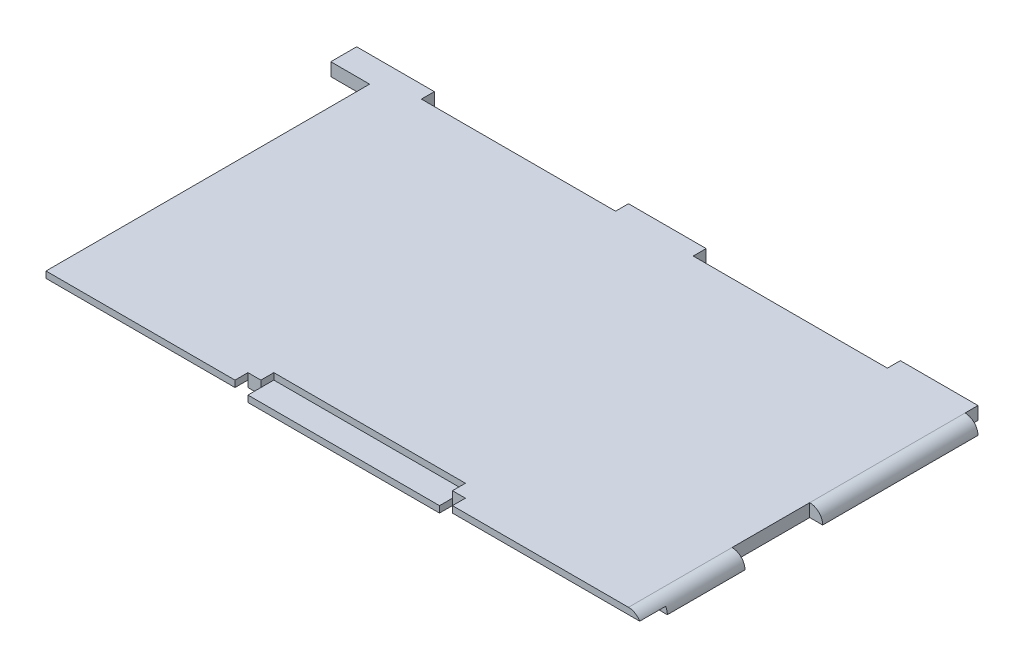
ISO-10303-21;
HEADER;
FILE_DESCRIPTION(('STEP AP214'),'2;1');
FILE_NAME('part.step','',(''),(''),'','','');
FILE_SCHEMA(('AUTOMOTIVE_DESIGN { 1 0 10303 214 1 1 1 1 }'));
ENDSEC;
DATA;
#1=APPLICATION_CONTEXT('core data for automotive mechanical design processes');
#2=APPLICATION_PROTOCOL_DEFINITION('international standard','automotive_design',2000,#1);
#3=PRODUCT_CONTEXT('',#1,'mechanical');
#4=PRODUCT('Part','Part','',(#3));
#5=PRODUCT_RELATED_PRODUCT_CATEGORY('part','',(#4));
#6=PRODUCT_DEFINITION_FORMATION('','',#4);
#7=PRODUCT_DEFINITION_CONTEXT('part definition',#1,'design');
#8=PRODUCT_DEFINITION('design','',#6,#7);
#9=PRODUCT_DEFINITION_SHAPE('','',#8);
#10=(LENGTH_UNIT() NAMED_UNIT(*) SI_UNIT(.MILLI.,.METRE.));
#11=(NAMED_UNIT(*) PLANE_ANGLE_UNIT() SI_UNIT($,.RADIAN.));
#12=(NAMED_UNIT(*) SI_UNIT($,.STERADIAN.) SOLID_ANGLE_UNIT());
#13=UNCERTAINTY_MEASURE_WITH_UNIT(LENGTH_MEASURE(1.E-05),#10,'distance_accuracy_value','');
#14=(GEOMETRIC_REPRESENTATION_CONTEXT(3) GLOBAL_UNCERTAINTY_ASSIGNED_CONTEXT((#13)) GLOBAL_UNIT_ASSIGNED_CONTEXT((#10,
#11,#12)) REPRESENTATION_CONTEXT('',''));
#15=CARTESIAN_POINT('',(0.,0.,0.));
#16=DIRECTION('',(0.,0.,1.));
#17=DIRECTION('',(1.,0.,0.));
#18=AXIS2_PLACEMENT_3D('',#15,#16,#17);
#19=CARTESIAN_POINT('',(208.746286717569,-5.,86.4649026606249));
#20=DIRECTION('',(0.,0.,-1.));
#21=DIRECTION('',(-1.,0.,0.));
#22=AXIS2_PLACEMENT_3D('',#19,#20,#21);
#23=PLANE('',#22);
#24=DIRECTION('',(-1.,0.,0.));
#25=VECTOR('',#24,1.);
#26=CARTESIAN_POINT('',(-21.2537132824313,2.5,86.4649026606249));
#27=LINE('',#26,#25);
#28=CARTESIAN_POINT('',(51.7462867175687,2.5,86.4649026606249));
#29=VERTEX_POINT('',#28);
#30=CARTESIAN_POINT('',(-21.2537132824313,2.5,86.4649026606249));
#31=VERTEX_POINT('',#30);
#32=EDGE_CURVE('E670',#29,#31,#27,.T.);
#33=ORIENTED_EDGE('',*,*,#32,.F.);
#34=DIRECTION('',(0.,-1.,0.));
#35=VECTOR('',#34,1.);
#36=CARTESIAN_POINT('',(51.7462867175687,0.,86.4649026606249));
#37=LINE('',#36,#35);
#38=CARTESIAN_POINT('',(51.7462867175687,5.,86.4649026606249));
#39=VERTEX_POINT('',#38);
#40=EDGE_CURVE('E1394',#39,#29,#37,.T.);
#41=ORIENTED_EDGE('',*,*,#40,.F.);
#42=DIRECTION('',(-1.,0.,0.));
#43=VECTOR('',#42,1.);
#44=CARTESIAN_POINT('',(208.746286717569,5.,86.4649026606249));
#45=LINE('',#44,#43);
#46=CARTESIAN_POINT('',(-21.2537132824313,5.,86.4649026606249));
#47=VERTEX_POINT('',#46);
#48=EDGE_CURVE('E703',#39,#47,#45,.T.);
#49=ORIENTED_EDGE('',*,*,#48,.T.);
#50=DIRECTION('',(0.,-1.,0.));
#51=VECTOR('',#50,1.);
#52=CARTESIAN_POINT('',(-21.2537132824313,5.,86.4649026606249));
#53=LINE('',#52,#51);
#54=EDGE_CURVE('E710',#47,#31,#53,.T.);
#55=ORIENTED_EDGE('',*,*,#54,.T.);
#56=EDGE_LOOP('',(#33,#41,#49,#55));
#57=FACE_BOUND('',#56,.T.);
#58=ADVANCED_FACE('F403',(#57),#23,.F.);
#59=DIRECTION('',(1.,0.,0.));
#60=VECTOR('',#59,1.);
#61=CARTESIAN_POINT('',(56.7462867175687,2.5,86.4649026606249));
#62=LINE('',#61,#60);
#63=CARTESIAN_POINT('',(56.7462867175687,2.5,86.4649026606249));
#64=VERTEX_POINT('',#63);
#65=CARTESIAN_POINT('',(130.746286717569,2.5,86.4649026606249));
#66=VERTEX_POINT('',#65);
#67=EDGE_CURVE('E687',#64,#66,#62,.T.);
#68=ORIENTED_EDGE('',*,*,#67,.F.);
#69=DIRECTION('',(0.,1.,0.));
#70=VECTOR('',#69,1.);
#71=CARTESIAN_POINT('',(56.7462867175687,0.,86.4649026606249));
#72=LINE('',#71,#70);
#73=CARTESIAN_POINT('',(56.7462867175687,0.,86.4649026606249));
#74=VERTEX_POINT('',#73);
#75=EDGE_CURVE('E1396',#74,#64,#72,.T.);
#76=ORIENTED_EDGE('',*,*,#75,.F.);
#77=DIRECTION('',(-1.,0.,0.));
#78=VECTOR('',#77,1.);
#79=CARTESIAN_POINT('',(0.,0.,86.4649026606249));
#80=LINE('',#79,#78);
#81=CARTESIAN_POINT('',(130.746286717569,0.,86.4649026606249));
#82=VERTEX_POINT('',#81);
#83=EDGE_CURVE('E708',#82,#74,#80,.T.);
#84=ORIENTED_EDGE('',*,*,#83,.F.);
#85=DIRECTION('',(0.,-1.,0.));
#86=VECTOR('',#85,1.);
#87=CARTESIAN_POINT('',(130.746286717569,5.,86.4649026606249));
#88=LINE('',#87,#86);
#89=EDGE_CURVE('E1397',#66,#82,#88,.T.);
#90=ORIENTED_EDGE('',*,*,#89,.F.);
#91=EDGE_LOOP('',(#68,#76,#84,#90));
#92=FACE_BOUND('',#91,.T.);
#93=ADVANCED_FACE('F996',(#92),#23,.F.);
#94=CARTESIAN_POINT('',(130.746286717569,2.5,76.4649026606249));
#95=DIRECTION('',(1.,0.,0.));
#96=DIRECTION('',(0.,0.,-1.));
#97=AXIS2_PLACEMENT_3D('',#94,#95,#96);
#98=PLANE('',#97);
#99=DIRECTION('',(0.,-1.,0.));
#100=VECTOR('',#99,1.);
#101=CARTESIAN_POINT('',(130.746286717569,5.,81.4649026606249));
#102=LINE('',#101,#100);
#103=CARTESIAN_POINT('',(130.746286717569,5.,81.4649026606249));
#104=VERTEX_POINT('',#103);
#105=CARTESIAN_POINT('',(130.746286717569,2.5,81.4649026606249));
#106=VERTEX_POINT('',#105);
#107=EDGE_CURVE('E896',#104,#106,#102,.T.);
#108=ORIENTED_EDGE('',*,*,#107,.F.);
#109=DIRECTION('',(0.,0.,1.));
#110=VECTOR('',#109,1.);
#111=CARTESIAN_POINT('',(130.746286717569,5.,76.4649026606249));
#112=LINE('',#111,#110);
#113=CARTESIAN_POINT('',(130.746286717569,5.,76.4649026606249));
#114=VERTEX_POINT('',#113);
#115=EDGE_CURVE('E680',#114,#104,#112,.T.);
#116=ORIENTED_EDGE('',*,*,#115,.F.);
#117=DIRECTION('',(0.,1.,0.));
#118=VECTOR('',#117,1.);
#119=CARTESIAN_POINT('',(130.746286717569,2.5,76.4649026606249));
#120=LINE('',#119,#118);
#121=CARTESIAN_POINT('',(130.746286717569,2.5,76.4649026606249));
#122=VERTEX_POINT('',#121);
#123=EDGE_CURVE('E693',#122,#114,#120,.T.);
#124=ORIENTED_EDGE('',*,*,#123,.F.);
#125=DIRECTION('',(0.,0.,1.));
#126=VECTOR('',#125,1.);
#127=CARTESIAN_POINT('',(130.746286717569,2.5,76.4649026606249));
#128=LINE('',#127,#126);
#129=EDGE_CURVE('E676',#122,#106,#128,.T.);
#130=ORIENTED_EDGE('',*,*,#129,.T.);
#131=EDGE_LOOP('',(#108,#116,#124,#130));
#132=FACE_BOUND('',#131,.T.);
#133=ADVANCED_FACE('F1003',(#132),#98,.F.);
#134=CARTESIAN_POINT('',(135.746286717569,2.5,76.4649026606249));
#135=DIRECTION('',(-1.,0.,0.));
#136=DIRECTION('',(0.,0.,1.));
#137=AXIS2_PLACEMENT_3D('',#134,#135,#136);
#138=PLANE('',#137);
#139=DIRECTION('',(0.,1.,0.));
#140=VECTOR('',#139,1.);
#141=CARTESIAN_POINT('',(135.746286717569,5.,81.4649026606249));
#142=LINE('',#141,#140);
#143=CARTESIAN_POINT('',(135.746286717569,0.,81.4649026606249));
#144=VERTEX_POINT('',#143);
#145=CARTESIAN_POINT('',(135.746286717569,2.5,81.4649026606249));
#146=VERTEX_POINT('',#145);
#147=EDGE_CURVE('E418',#144,#146,#142,.T.);
#148=ORIENTED_EDGE('',*,*,#147,.F.);
#149=DIRECTION('',(0.,0.,1.));
#150=VECTOR('',#149,1.);
#151=CARTESIAN_POINT('',(135.746286717569,0.,76.4649026606249));
#152=LINE('',#151,#150);
#153=CARTESIAN_POINT('',(135.746286717569,0.,76.4649026606249));
#154=VERTEX_POINT('',#153);
#155=EDGE_CURVE('E656',#154,#144,#152,.T.);
#156=ORIENTED_EDGE('',*,*,#155,.F.);
#157=DIRECTION('',(0.,-1.,0.));
#158=VECTOR('',#157,1.);
#159=CARTESIAN_POINT('',(135.746286717569,2.5,76.4649026606249));
#160=LINE('',#159,#158);
#161=CARTESIAN_POINT('',(135.746286717569,2.5,76.4649026606249));
#162=VERTEX_POINT('',#161);
#163=EDGE_CURVE('E667',#162,#154,#160,.T.);
#164=ORIENTED_EDGE('',*,*,#163,.F.);
#165=DIRECTION('',(0.,0.,1.));
#166=VECTOR('',#165,1.);
#167=CARTESIAN_POINT('',(135.746286717569,2.5,76.4649026606249));
#168=LINE('',#167,#166);
#169=EDGE_CURVE('E660',#162,#146,#168,.T.);
#170=ORIENTED_EDGE('',*,*,#169,.T.);
#171=EDGE_LOOP('',(#148,#156,#164,#170));
#172=FACE_BOUND('',#171,.T.);
#173=ADVANCED_FACE('F887',(#172),#138,.F.);
#174=CARTESIAN_POINT('',(203.746286717569,5.,0.));
#175=DIRECTION('',(1.,0.,0.));
#176=DIRECTION('',(0.,0.,-1.));
#177=AXIS2_PLACEMENT_3D('',#174,#175,#176);
#178=PLANE('',#177);
#179=DIRECTION('',(0.,0.,1.));
#180=VECTOR('',#179,1.);
#181=CARTESIAN_POINT('',(203.746286717569,5.,0.));
#182=LINE('',#181,#180);
#183=CARTESIAN_POINT('',(203.746286717569,5.,16.4649026606249));
#184=VERTEX_POINT('',#183);
#185=CARTESIAN_POINT('',(203.746286717569,5.,46.4649026606249));
#186=VERTEX_POINT('',#185);
#187=EDGE_CURVE('E714',#184,#186,#182,.T.);
#188=ORIENTED_EDGE('',*,*,#187,.T.);
#189=DIRECTION('',(0.,-1.,0.));
#190=VECTOR('',#189,1.);
#191=CARTESIAN_POINT('',(203.746286717569,5.,46.4649026606249));
#192=LINE('',#191,#190);
#193=CARTESIAN_POINT('',(203.746286717569,0.,46.4649026606249));
#194=VERTEX_POINT('',#193);
#195=EDGE_CURVE('E807',#186,#194,#192,.T.);
#196=ORIENTED_EDGE('',*,*,#195,.T.);
#197=DIRECTION('',(0.,0.,1.));
#198=VECTOR('',#197,1.);
#199=CARTESIAN_POINT('',(203.746286717569,0.,0.));
#200=LINE('',#199,#198);
#201=CARTESIAN_POINT('',(203.746286717569,0.,16.4649026606249));
#202=VERTEX_POINT('',#201);
#203=EDGE_CURVE('E743',#202,#194,#200,.T.);
#204=ORIENTED_EDGE('',*,*,#203,.F.);
#205=DIRECTION('',(0.,-1.,0.));
#206=VECTOR('',#205,1.);
#207=CARTESIAN_POINT('',(203.746286717569,5.,16.4649026606249));
#208=LINE('',#207,#206);
#209=EDGE_CURVE('E801',#184,#202,#208,.T.);
#210=ORIENTED_EDGE('',*,*,#209,.F.);
#211=EDGE_LOOP('',(#188,#196,#204,#210));
#212=FACE_BOUND('',#211,.T.);
#213=ADVANCED_FACE('F985',(#212),#178,.T.);
#214=CARTESIAN_POINT('',(0.,5.,16.4649026606249));
#215=DIRECTION('',(0.,0.,-1.));
#216=DIRECTION('',(-1.,0.,0.));
#217=AXIS2_PLACEMENT_3D('',#214,#215,#216);
#218=PLANE('',#217);
#219=DIRECTION('',(1.,0.,0.));
#220=VECTOR('',#219,1.);
#221=CARTESIAN_POINT('',(0.,0.,16.4649026606249));
#222=LINE('',#221,#220);
#223=CARTESIAN_POINT('',(208.746286717569,0.,16.4649026606249));
#224=VERTEX_POINT('',#223);
#225=EDGE_CURVE('E746',#202,#224,#222,.T.);
#226=ORIENTED_EDGE('',*,*,#225,.T.);
#227=CARTESIAN_POINT('',(203.746286717569,0.,16.4649026606249));
#228=DIRECTION('',(0.,0.,-1.));
#229=DIRECTION('',(-1.,0.,0.));
#230=AXIS2_PLACEMENT_3D('',#227,#228,#229);
#231=CIRCLE('',#230,5.);
#232=EDGE_CURVE('E835',#224,#184,#231,.F.);
#233=ORIENTED_EDGE('',*,*,#232,.T.);
#234=ORIENTED_EDGE('',*,*,#209,.T.);
#235=EDGE_LOOP('',(#226,#233,#234));
#236=FACE_BOUND('',#235,.T.);
#237=ADVANCED_FACE('F986',(#236),#218,.F.);
#238=CARTESIAN_POINT('',(0.,5.,-43.5350973393751));
#239=DIRECTION('',(0.,0.,-1.));
#240=DIRECTION('',(-1.,0.,0.));
#241=AXIS2_PLACEMENT_3D('',#238,#239,#240);
#242=PLANE('',#241);
#243=DIRECTION('',(0.,-1.,0.));
#244=VECTOR('',#243,1.);
#245=CARTESIAN_POINT('',(203.746286717569,5.,-43.5350973393751));
#246=LINE('',#245,#244);
#247=CARTESIAN_POINT('',(203.746286717569,5.,-43.5350973393751));
#248=VERTEX_POINT('',#247);
#249=CARTESIAN_POINT('',(203.746286717569,0.,-43.5350973393751));
#250=VERTEX_POINT('',#249);
#251=EDGE_CURVE('E799',#248,#250,#246,.T.);
#252=ORIENTED_EDGE('',*,*,#251,.F.);
#253=CARTESIAN_POINT('',(203.746286717569,0.,-43.5350973393751));
#254=DIRECTION('',(0.,0.,-1.));
#255=DIRECTION('',(-1.,0.,0.));
#256=AXIS2_PLACEMENT_3D('',#253,#254,#255);
#257=CIRCLE('',#256,5.);
#258=CARTESIAN_POINT('',(208.746286717569,0.,-43.5350973393751));
#259=VERTEX_POINT('',#258);
#260=EDGE_CURVE('E841',#248,#259,#257,.T.);
#261=ORIENTED_EDGE('',*,*,#260,.T.);
#262=DIRECTION('',(1.,0.,0.));
#263=VECTOR('',#262,1.);
#264=CARTESIAN_POINT('',(0.,0.,-43.5350973393751));
#265=LINE('',#264,#263);
#266=EDGE_CURVE('E753',#250,#259,#265,.T.);
#267=ORIENTED_EDGE('',*,*,#266,.F.);
#268=EDGE_LOOP('',(#252,#261,#267));
#269=FACE_BOUND('',#268,.T.);
#270=ADVANCED_FACE('F979',(#269),#242,.T.);
#271=CARTESIAN_POINT('',(203.746286717569,5.,0.));
#272=DIRECTION('',(-1.,0.,0.));
#273=DIRECTION('',(0.,0.,1.));
#274=AXIS2_PLACEMENT_3D('',#271,#272,#273);
#275=PLANE('',#274);
#276=DIRECTION('',(0.,0.,-1.));
#277=VECTOR('',#276,1.);
#278=CARTESIAN_POINT('',(203.746286717569,0.,0.));
#279=LINE('',#278,#277);
#280=CARTESIAN_POINT('',(203.746286717569,0.,-48.5350973393751));
#281=VERTEX_POINT('',#280);
#282=EDGE_CURVE('E756',#250,#281,#279,.T.);
#283=ORIENTED_EDGE('',*,*,#282,.T.);
#284=DIRECTION('',(0.,-1.,0.));
#285=VECTOR('',#284,1.);
#286=CARTESIAN_POINT('',(203.746286717569,5.,-48.5350973393751));
#287=LINE('',#286,#285);
#288=CARTESIAN_POINT('',(203.746286717569,5.,-48.5350973393751));
#289=VERTEX_POINT('',#288);
#290=EDGE_CURVE('E796',#289,#281,#287,.T.);
#291=ORIENTED_EDGE('',*,*,#290,.F.);
#292=DIRECTION('',(0.,0.,-1.));
#293=VECTOR('',#292,1.);
#294=CARTESIAN_POINT('',(203.746286717569,5.,0.));
#295=LINE('',#294,#293);
#296=EDGE_CURVE('E717',#248,#289,#295,.T.);
#297=ORIENTED_EDGE('',*,*,#296,.F.);
#298=ORIENTED_EDGE('',*,*,#251,.T.);
#299=EDGE_LOOP('',(#283,#291,#297,#298));
#300=FACE_BOUND('',#299,.T.);
#301=ADVANCED_FACE('F973',(#300),#275,.F.);
#302=CARTESIAN_POINT('',(0.,5.,-48.5350973393751));
#303=DIRECTION('',(0.,0.,1.));
#304=DIRECTION('',(1.,0.,0.));
#305=AXIS2_PLACEMENT_3D('',#302,#303,#304);
#306=PLANE('',#305);
#307=DIRECTION('',(-1.,0.,0.));
#308=VECTOR('',#307,1.);
#309=CARTESIAN_POINT('',(0.,0.,-48.5350973393751));
#310=LINE('',#309,#308);
#311=CARTESIAN_POINT('',(173.746286717569,0.,-48.5350973393751));
#312=VERTEX_POINT('',#311);
#313=EDGE_CURVE('E758',#281,#312,#310,.T.);
#314=ORIENTED_EDGE('',*,*,#313,.T.);
#315=DIRECTION('',(0.,-1.,0.));
#316=VECTOR('',#315,1.);
#317=CARTESIAN_POINT('',(173.746286717569,5.,-48.5350973393751));
#318=LINE('',#317,#316);
#319=CARTESIAN_POINT('',(173.746286717569,5.,-48.5350973393751));
#320=VERTEX_POINT('',#319);
#321=EDGE_CURVE('E794',#320,#312,#318,.T.);
#322=ORIENTED_EDGE('',*,*,#321,.F.);
#323=DIRECTION('',(-1.,0.,0.));
#324=VECTOR('',#323,1.);
#325=CARTESIAN_POINT('',(0.,5.,-48.5350973393751));
#326=LINE('',#325,#324);
#327=EDGE_CURVE('E720',#289,#320,#326,.T.);
#328=ORIENTED_EDGE('',*,*,#327,.F.);
#329=ORIENTED_EDGE('',*,*,#290,.T.);
#330=EDGE_LOOP('',(#314,#322,#328,#329));
#331=FACE_BOUND('',#330,.T.);
#332=ADVANCED_FACE('F969',(#331),#306,.F.);
#333=CARTESIAN_POINT('',(173.746286717569,5.,0.));
#334=DIRECTION('',(-1.,0.,0.));
#335=DIRECTION('',(0.,0.,1.));
#336=AXIS2_PLACEMENT_3D('',#333,#334,#335);
#337=PLANE('',#336);
#338=DIRECTION('',(0.,0.,-1.));
#339=VECTOR('',#338,1.);
#340=CARTESIAN_POINT('',(173.746286717569,0.,0.));
#341=LINE('',#340,#339);
#342=CARTESIAN_POINT('',(173.746286717569,0.,-43.5350973393751));
#343=VERTEX_POINT('',#342);
#344=EDGE_CURVE('E761',#343,#312,#341,.T.);
#345=ORIENTED_EDGE('',*,*,#344,.F.);
#346=DIRECTION('',(0.,-1.,0.));
#347=VECTOR('',#346,1.);
#348=CARTESIAN_POINT('',(173.746286717569,5.,-43.5350973393751));
#349=LINE('',#348,#347);
#350=CARTESIAN_POINT('',(173.746286717569,5.,-43.5350973393751));
#351=VERTEX_POINT('',#350);
#352=EDGE_CURVE('E791',#351,#343,#349,.T.);
#353=ORIENTED_EDGE('',*,*,#352,.F.);
#354=DIRECTION('',(0.,0.,-1.));
#355=VECTOR('',#354,1.);
#356=CARTESIAN_POINT('',(173.746286717569,5.,0.));
#357=LINE('',#356,#355);
#358=EDGE_CURVE('E722',#351,#320,#357,.T.);
#359=ORIENTED_EDGE('',*,*,#358,.T.);
#360=ORIENTED_EDGE('',*,*,#321,.T.);
#361=EDGE_LOOP('',(#345,#353,#359,#360));
#362=FACE_BOUND('',#361,.T.);
#363=ADVANCED_FACE('F964',(#362),#337,.T.);
#364=CARTESIAN_POINT('',(0.,5.,-43.5350973393751));
#365=DIRECTION('',(0.,0.,-1.));
#366=DIRECTION('',(-1.,0.,0.));
#367=AXIS2_PLACEMENT_3D('',#364,#365,#366);
#368=PLANE('',#367);
#369=DIRECTION('',(1.,0.,0.));
#370=VECTOR('',#369,1.);
#371=CARTESIAN_POINT('',(0.,0.,-43.5350973393751));
#372=LINE('',#371,#370);
#373=CARTESIAN_POINT('',(98.7462867175687,0.,-43.5350973393751));
#374=VERTEX_POINT('',#373);
#375=EDGE_CURVE('E764',#374,#343,#372,.T.);
#376=ORIENTED_EDGE('',*,*,#375,.F.);
#377=DIRECTION('',(0.,1.,0.));
#378=VECTOR('',#377,1.);
#379=CARTESIAN_POINT('',(98.7462867175687,5.,-43.5350973393751));
#380=LINE('',#379,#378);
#381=CARTESIAN_POINT('',(98.7462867175687,5.,-43.5350973393751));
#382=VERTEX_POINT('',#381);
#383=EDGE_CURVE('E805',#374,#382,#380,.T.);
#384=ORIENTED_EDGE('',*,*,#383,.T.);
#385=DIRECTION('',(1.,0.,0.));
#386=VECTOR('',#385,1.);
#387=CARTESIAN_POINT('',(0.,5.,-43.5350973393751));
#388=LINE('',#387,#386);
#389=EDGE_CURVE('E725',#382,#351,#388,.T.);
#390=ORIENTED_EDGE('',*,*,#389,.T.);
#391=ORIENTED_EDGE('',*,*,#352,.T.);
#392=EDGE_LOOP('',(#376,#384,#390,#391));
#393=FACE_BOUND('',#392,.T.);
#394=ADVANCED_FACE('F958',(#393),#368,.T.);
#395=DIRECTION('',(0.,1.,0.));
#396=VECTOR('',#395,1.);
#397=CARTESIAN_POINT('',(68.7462867175687,5.,-43.5350973393751));
#398=LINE('',#397,#396);
#399=CARTESIAN_POINT('',(68.7462867175687,0.,-43.5350973393751));
#400=VERTEX_POINT('',#399);
#401=CARTESIAN_POINT('',(68.7462867175687,5.,-43.5350973393751));
#402=VERTEX_POINT('',#401);
#403=EDGE_CURVE('E803',#400,#402,#398,.T.);
#404=ORIENTED_EDGE('',*,*,#403,.F.);
#405=CARTESIAN_POINT('',(-6.25371328243131,0.,-43.5350973393751));
#406=VERTEX_POINT('',#405);
#407=EDGE_CURVE('E765',#406,#400,#372,.T.);
#408=ORIENTED_EDGE('',*,*,#407,.F.);
#409=DIRECTION('',(0.,-1.,0.));
#410=VECTOR('',#409,1.);
#411=CARTESIAN_POINT('',(-6.25371328243131,5.,-43.5350973393751));
#412=LINE('',#411,#410);
#413=CARTESIAN_POINT('',(-6.25371328243131,5.,-43.5350973393751));
#414=VERTEX_POINT('',#413);
#415=EDGE_CURVE('E789',#414,#406,#412,.T.);
#416=ORIENTED_EDGE('',*,*,#415,.F.);
#417=EDGE_CURVE('E726',#414,#402,#388,.T.);
#418=ORIENTED_EDGE('',*,*,#417,.T.);
#419=EDGE_LOOP('',(#404,#408,#416,#418));
#420=FACE_BOUND('',#419,.T.);
#421=ADVANCED_FACE('F941',(#420),#368,.T.);
#422=CARTESIAN_POINT('',(-6.25371328243131,5.,0.));
#423=DIRECTION('',(-1.,0.,0.));
#424=DIRECTION('',(0.,0.,1.));
#425=AXIS2_PLACEMENT_3D('',#422,#423,#424);
#426=PLANE('',#425);
#427=DIRECTION('',(0.,0.,-1.));
#428=VECTOR('',#427,1.);
#429=CARTESIAN_POINT('',(-6.25371328243131,0.,0.));
#430=LINE('',#429,#428);
#431=CARTESIAN_POINT('',(-6.25371328243131,0.,-48.5350973393751));
#432=VERTEX_POINT('',#431);
#433=EDGE_CURVE('E768',#406,#432,#430,.T.);
#434=ORIENTED_EDGE('',*,*,#433,.T.);
#435=DIRECTION('',(0.,-1.,0.));
#436=VECTOR('',#435,1.);
#437=CARTESIAN_POINT('',(-6.25371328243131,5.,-48.5350973393751));
#438=LINE('',#437,#436);
#439=CARTESIAN_POINT('',(-6.25371328243131,5.,-48.5350973393751));
#440=VERTEX_POINT('',#439);
#441=EDGE_CURVE('E787',#440,#432,#438,.T.);
#442=ORIENTED_EDGE('',*,*,#441,.F.);
#443=DIRECTION('',(0.,0.,-1.));
#444=VECTOR('',#443,1.);
#445=CARTESIAN_POINT('',(-6.25371328243131,5.,0.));
#446=LINE('',#445,#444);
#447=EDGE_CURVE('E729',#414,#440,#446,.T.);
#448=ORIENTED_EDGE('',*,*,#447,.F.);
#449=ORIENTED_EDGE('',*,*,#415,.T.);
#450=EDGE_LOOP('',(#434,#442,#448,#449));
#451=FACE_BOUND('',#450,.T.);
#452=ADVANCED_FACE('F938',(#451),#426,.F.);
#453=CARTESIAN_POINT('',(0.,5.,-48.5350973393751));
#454=DIRECTION('',(0.,0.,-1.));
#455=DIRECTION('',(-1.,0.,0.));
#456=AXIS2_PLACEMENT_3D('',#453,#454,#455);
#457=PLANE('',#456);
#458=DIRECTION('',(1.,0.,0.));
#459=VECTOR('',#458,1.);
#460=CARTESIAN_POINT('',(0.,0.,-48.5350973393751));
#461=LINE('',#460,#459);
#462=CARTESIAN_POINT('',(-36.2537132824313,0.,-48.5350973393751));
#463=VERTEX_POINT('',#462);
#464=EDGE_CURVE('E771',#463,#432,#461,.T.);
#465=ORIENTED_EDGE('',*,*,#464,.F.);
#466=DIRECTION('',(0.,-1.,0.));
#467=VECTOR('',#466,1.);
#468=CARTESIAN_POINT('',(-36.2537132824313,5.,-48.5350973393751));
#469=LINE('',#468,#467);
#470=CARTESIAN_POINT('',(-36.2537132824313,5.,-48.5350973393751));
#471=VERTEX_POINT('',#470);
#472=EDGE_CURVE('E785',#471,#463,#469,.T.);
#473=ORIENTED_EDGE('',*,*,#472,.F.);
#474=DIRECTION('',(1.,0.,0.));
#475=VECTOR('',#474,1.);
#476=CARTESIAN_POINT('',(0.,5.,-48.5350973393751));
#477=LINE('',#476,#475);
#478=EDGE_CURVE('E731',#471,#440,#477,.T.);
#479=ORIENTED_EDGE('',*,*,#478,.T.);
#480=ORIENTED_EDGE('',*,*,#441,.T.);
#481=EDGE_LOOP('',(#465,#473,#479,#480));
#482=FACE_BOUND('',#481,.T.);
#483=ADVANCED_FACE('F934',(#482),#457,.T.);
#484=CARTESIAN_POINT('',(-36.2537132824313,5.,0.));
#485=DIRECTION('',(-1.,0.,0.));
#486=DIRECTION('',(0.,0.,1.));
#487=AXIS2_PLACEMENT_3D('',#484,#485,#486);
#488=PLANE('',#487);
#489=DIRECTION('',(0.,0.,-1.));
#490=VECTOR('',#489,1.);
#491=CARTESIAN_POINT('',(-36.2537132824313,0.,0.));
#492=LINE('',#491,#490);
#493=CARTESIAN_POINT('',(-36.2537132824313,0.,-38.5350973393751));
#494=VERTEX_POINT('',#493);
#495=EDGE_CURVE('E774',#494,#463,#492,.T.);
#496=ORIENTED_EDGE('',*,*,#495,.F.);
#497=DIRECTION('',(0.,-1.,0.));
#498=VECTOR('',#497,1.);
#499=CARTESIAN_POINT('',(-36.2537132824313,5.,-38.5350973393751));
#500=LINE('',#499,#498);
#501=CARTESIAN_POINT('',(-36.2537132824313,5.,-38.5350973393751));
#502=VERTEX_POINT('',#501);
#503=EDGE_CURVE('E783',#502,#494,#500,.T.);
#504=ORIENTED_EDGE('',*,*,#503,.F.);
#505=DIRECTION('',(0.,0.,-1.));
#506=VECTOR('',#505,1.);
#507=CARTESIAN_POINT('',(-36.2537132824313,5.,0.));
#508=LINE('',#507,#506);
#509=EDGE_CURVE('E734',#502,#471,#508,.T.);
#510=ORIENTED_EDGE('',*,*,#509,.T.);
#511=ORIENTED_EDGE('',*,*,#472,.T.);
#512=EDGE_LOOP('',(#496,#504,#510,#511));
#513=FACE_BOUND('',#512,.T.);
#514=ADVANCED_FACE('F930',(#513),#488,.T.);
#515=CARTESIAN_POINT('',(0.,5.,-38.5350973393751));
#516=DIRECTION('',(0.,0.,1.));
#517=DIRECTION('',(1.,0.,0.));
#518=AXIS2_PLACEMENT_3D('',#515,#516,#517);
#519=PLANE('',#518);
#520=DIRECTION('',(-1.,0.,0.));
#521=VECTOR('',#520,1.);
#522=CARTESIAN_POINT('',(0.,0.,-38.5350973393751));
#523=LINE('',#522,#521);
#524=CARTESIAN_POINT('',(-21.2537132824313,0.,-38.5350973393751));
#525=VERTEX_POINT('',#524);
#526=EDGE_CURVE('E777',#525,#494,#523,.T.);
#527=ORIENTED_EDGE('',*,*,#526,.F.);
#528=DIRECTION('',(0.,-1.,0.));
#529=VECTOR('',#528,1.);
#530=CARTESIAN_POINT('',(-21.2537132824313,5.,-38.5350973393751));
#531=LINE('',#530,#529);
#532=CARTESIAN_POINT('',(-21.2537132824313,5.,-38.5350973393751));
#533=VERTEX_POINT('',#532);
#534=EDGE_CURVE('E742',#533,#525,#531,.T.);
#535=ORIENTED_EDGE('',*,*,#534,.F.);
#536=DIRECTION('',(-1.,0.,0.));
#537=VECTOR('',#536,1.);
#538=CARTESIAN_POINT('',(0.,5.,-38.5350973393751));
#539=LINE('',#538,#537);
#540=EDGE_CURVE('E737',#533,#502,#539,.T.);
#541=ORIENTED_EDGE('',*,*,#540,.T.);
#542=ORIENTED_EDGE('',*,*,#503,.T.);
#543=EDGE_LOOP('',(#527,#535,#541,#542));
#544=FACE_BOUND('',#543,.T.);
#545=ADVANCED_FACE('F925',(#544),#519,.T.);
#546=CARTESIAN_POINT('',(-21.2537132824313,5.,0.));
#547=DIRECTION('',(-1.,0.,0.));
#548=DIRECTION('',(0.,0.,1.));
#549=AXIS2_PLACEMENT_3D('',#546,#547,#548);
#550=PLANE('',#549);
#551=DIRECTION('',(0.,0.,1.));
#552=VECTOR('',#551,1.);
#553=CARTESIAN_POINT('',(-21.2537132824313,2.5,76.4649026606249));
#554=LINE('',#553,#552);
#555=CARTESIAN_POINT('',(-21.2537132824313,2.5,76.4649026606249));
#556=VERTEX_POINT('',#555);
#557=EDGE_CURVE('E704',#556,#31,#554,.T.);
#558=ORIENTED_EDGE('',*,*,#557,.T.);
#559=ORIENTED_EDGE('',*,*,#54,.F.);
#560=DIRECTION('',(0.,0.,-1.));
#561=VECTOR('',#560,1.);
#562=CARTESIAN_POINT('',(-21.2537132824313,5.,0.));
#563=LINE('',#562,#561);
#564=EDGE_CURVE('E740',#47,#533,#563,.T.);
#565=ORIENTED_EDGE('',*,*,#564,.T.);
#566=ORIENTED_EDGE('',*,*,#534,.T.);
#567=DIRECTION('',(0.,0.,-1.));
#568=VECTOR('',#567,1.);
#569=CARTESIAN_POINT('',(-21.2537132824313,0.,0.));
#570=LINE('',#569,#568);
#571=CARTESIAN_POINT('',(-21.2537132824313,0.,76.4649026606249));
#572=VERTEX_POINT('',#571);
#573=EDGE_CURVE('E718',#572,#525,#570,.T.);
#574=ORIENTED_EDGE('',*,*,#573,.F.);
#575=DIRECTION('',(0.,-1.,0.));
#576=VECTOR('',#575,1.);
#577=CARTESIAN_POINT('',(-21.2537132824313,0.,76.4649026606249));
#578=LINE('',#577,#576);
#579=EDGE_CURVE('E903',#556,#572,#578,.T.);
#580=ORIENTED_EDGE('',*,*,#579,.F.);
#581=EDGE_LOOP('',(#558,#559,#565,#566,#574,#580));
#582=FACE_BOUND('',#581,.T.);
#583=ADVANCED_FACE('F919',(#582),#550,.T.);
#584=CARTESIAN_POINT('',(0.,0.,0.));
#585=DIRECTION('',(0.,1.,0.));
#586=DIRECTION('',(0.,0.,1.));
#587=AXIS2_PLACEMENT_3D('',#584,#585,#586);
#588=PLANE('',#587);
#589=ORIENTED_EDGE('',*,*,#83,.T.);
#590=DIRECTION('',(0.,0.,1.));
#591=VECTOR('',#590,1.);
#592=CARTESIAN_POINT('',(56.7462867175687,0.,81.4649026606249));
#593=LINE('',#592,#591);
#594=CARTESIAN_POINT('',(56.7462867175687,0.,81.4649026606249));
#595=VERTEX_POINT('',#594);
#596=EDGE_CURVE('E639',#595,#74,#593,.T.);
#597=ORIENTED_EDGE('',*,*,#596,.F.);
#598=DIRECTION('',(1.,0.,0.));
#599=VECTOR('',#598,1.);
#600=CARTESIAN_POINT('',(51.7462867175687,0.,81.4649026606249));
#601=LINE('',#600,#599);
#602=CARTESIAN_POINT('',(51.7462867175687,0.,81.4649026606249));
#603=VERTEX_POINT('',#602);
#604=EDGE_CURVE('E628',#603,#595,#601,.T.);
#605=ORIENTED_EDGE('',*,*,#604,.F.);
#606=DIRECTION('',(0.,0.,1.));
#607=VECTOR('',#606,1.);
#608=CARTESIAN_POINT('',(51.7462867175687,0.,76.4649026606249));
#609=LINE('',#608,#607);
#610=CARTESIAN_POINT('',(51.7462867175687,0.,76.4649026606249));
#611=VERTEX_POINT('',#610);
#612=EDGE_CURVE('E638',#611,#603,#609,.T.);
#613=ORIENTED_EDGE('',*,*,#612,.F.);
#614=DIRECTION('',(1.,0.,0.));
#615=VECTOR('',#614,1.);
#616=CARTESIAN_POINT('',(-21.2537132824313,0.,76.4649026606249));
#617=LINE('',#616,#615);
#618=EDGE_CURVE('E905',#572,#611,#617,.T.);
#619=ORIENTED_EDGE('',*,*,#618,.F.);
#620=ORIENTED_EDGE('',*,*,#573,.T.);
#621=ORIENTED_EDGE('',*,*,#526,.T.);
#622=ORIENTED_EDGE('',*,*,#495,.T.);
#623=ORIENTED_EDGE('',*,*,#464,.T.);
#624=ORIENTED_EDGE('',*,*,#433,.F.);
#625=ORIENTED_EDGE('',*,*,#407,.T.);
#626=DIRECTION('',(0.,0.,-1.));
#627=VECTOR('',#626,1.);
#628=CARTESIAN_POINT('',(68.7462867175687,0.,-43.5350973393751));
#629=LINE('',#628,#627);
#630=CARTESIAN_POINT('',(68.7462867175687,0.,-48.5350973393751));
#631=VERTEX_POINT('',#630);
#632=EDGE_CURVE('E824',#400,#631,#629,.T.);
#633=ORIENTED_EDGE('',*,*,#632,.T.);
#634=DIRECTION('',(1.,0.,0.));
#635=VECTOR('',#634,1.);
#636=CARTESIAN_POINT('',(83.7462867175687,0.,-48.5350973393751));
#637=LINE('',#636,#635);
#638=CARTESIAN_POINT('',(98.7462867175687,0.,-48.5350973393751));
#639=VERTEX_POINT('',#638);
#640=EDGE_CURVE('E811',#631,#639,#637,.T.);
#641=ORIENTED_EDGE('',*,*,#640,.T.);
#642=DIRECTION('',(0.,0.,-1.));
#643=VECTOR('',#642,1.);
#644=CARTESIAN_POINT('',(98.7462867175687,0.,-43.5350973393751));
#645=LINE('',#644,#643);
#646=EDGE_CURVE('E814',#374,#639,#645,.T.);
#647=ORIENTED_EDGE('',*,*,#646,.F.);
#648=ORIENTED_EDGE('',*,*,#375,.T.);
#649=ORIENTED_EDGE('',*,*,#344,.T.);
#650=ORIENTED_EDGE('',*,*,#313,.F.);
#651=ORIENTED_EDGE('',*,*,#282,.F.);
#652=ORIENTED_EDGE('',*,*,#266,.T.);
#653=DIRECTION('',(0.,0.,1.));
#654=VECTOR('',#653,1.);
#655=CARTESIAN_POINT('',(208.746286717569,0.,0.));
#656=LINE('',#655,#654);
#657=EDGE_CURVE('E750',#259,#224,#656,.T.);
#658=ORIENTED_EDGE('',*,*,#657,.T.);
#659=ORIENTED_EDGE('',*,*,#225,.F.);
#660=ORIENTED_EDGE('',*,*,#203,.T.);
#661=DIRECTION('',(1.,0.,0.));
#662=VECTOR('',#661,1.);
#663=CARTESIAN_POINT('',(203.746286717569,0.,46.4649026606249));
#664=LINE('',#663,#662);
#665=CARTESIAN_POINT('',(208.746286717569,0.,46.4649026606249));
#666=VERTEX_POINT('',#665);
#667=EDGE_CURVE('E713',#194,#666,#664,.T.);
#668=ORIENTED_EDGE('',*,*,#667,.T.);
#669=DIRECTION('',(0.,0.,1.));
#670=VECTOR('',#669,1.);
#671=CARTESIAN_POINT('',(208.746286717569,0.,46.4649026606249));
#672=LINE('',#671,#670);
#673=CARTESIAN_POINT('',(208.746286717569,0.,76.4649026606249));
#674=VERTEX_POINT('',#673);
#675=EDGE_CURVE('E827',#666,#674,#672,.T.);
#676=ORIENTED_EDGE('',*,*,#675,.T.);
#677=DIRECTION('',(1.,0.,0.));
#678=VECTOR('',#677,1.);
#679=CARTESIAN_POINT('',(135.746286717569,0.,76.4649026606249));
#680=LINE('',#679,#678);
#681=EDGE_CURVE('E665',#154,#674,#680,.T.);
#682=ORIENTED_EDGE('',*,*,#681,.F.);
#683=ORIENTED_EDGE('',*,*,#155,.T.);
#684=DIRECTION('',(1.,0.,0.));
#685=VECTOR('',#684,1.);
#686=CARTESIAN_POINT('',(130.746286717569,0.,81.4649026606249));
#687=LINE('',#686,#685);
#688=CARTESIAN_POINT('',(130.746286717569,0.,81.4649026606249));
#689=VERTEX_POINT('',#688);
#690=EDGE_CURVE('E890',#689,#144,#687,.T.);
#691=ORIENTED_EDGE('',*,*,#690,.F.);
#692=DIRECTION('',(0.,0.,1.));
#693=VECTOR('',#692,1.);
#694=CARTESIAN_POINT('',(130.746286717569,0.,81.4649026606249));
#695=LINE('',#694,#693);
#696=EDGE_CURVE('E892',#689,#82,#695,.T.);
#697=ORIENTED_EDGE('',*,*,#696,.T.);
#698=EDGE_LOOP('',(#589,#597,#605,#613,#619,#620,#621,#622,#623,#624,#625,#633,#641,#647,#648,
#649,#650,#651,#652,#658,#659,#660,#668,#676,#682,#683,#691,#697));
#699=FACE_BOUND('',#698,.T.);
#700=ADVANCED_FACE('F636',(#699),#588,.F.);
#701=CARTESIAN_POINT('',(0.,5.,0.));
#702=DIRECTION('',(0.,1.,0.));
#703=DIRECTION('',(0.,0.,1.));
#704=AXIS2_PLACEMENT_3D('',#701,#702,#703);
#705=PLANE('',#704);
#706=DIRECTION('',(0.,0.,1.));
#707=VECTOR('',#706,1.);
#708=CARTESIAN_POINT('',(51.7462867175687,5.,81.4649026606249));
#709=LINE('',#708,#707);
#710=CARTESIAN_POINT('',(51.7462867175687,5.,81.4649026606249));
#711=VERTEX_POINT('',#710);
#712=EDGE_CURVE('E686',#711,#39,#709,.T.);
#713=ORIENTED_EDGE('',*,*,#712,.F.);
#714=DIRECTION('',(-1.,0.,0.));
#715=VECTOR('',#714,1.);
#716=CARTESIAN_POINT('',(51.7462867175687,5.,81.4649026606249));
#717=LINE('',#716,#715);
#718=CARTESIAN_POINT('',(56.7462867175687,5.,81.4649026606249));
#719=VERTEX_POINT('',#718);
#720=EDGE_CURVE('E1390',#719,#711,#717,.T.);
#721=ORIENTED_EDGE('',*,*,#720,.F.);
#722=DIRECTION('',(0.,0.,1.));
#723=VECTOR('',#722,1.);
#724=CARTESIAN_POINT('',(56.7462867175687,5.,76.4649026606249));
#725=LINE('',#724,#723);
#726=CARTESIAN_POINT('',(56.7462867175687,5.,76.4649026606249));
#727=VERTEX_POINT('',#726);
#728=EDGE_CURVE('E683',#727,#719,#725,.T.);
#729=ORIENTED_EDGE('',*,*,#728,.F.);
#730=DIRECTION('',(-1.,0.,0.));
#731=VECTOR('',#730,1.);
#732=CARTESIAN_POINT('',(56.7462867175687,5.,76.4649026606249));
#733=LINE('',#732,#731);
#734=EDGE_CURVE('E674',#114,#727,#733,.T.);
#735=ORIENTED_EDGE('',*,*,#734,.F.);
#736=ORIENTED_EDGE('',*,*,#115,.T.);
#737=DIRECTION('',(-1.,0.,0.));
#738=VECTOR('',#737,1.);
#739=CARTESIAN_POINT('',(130.746286717569,5.,81.4649026606249));
#740=LINE('',#739,#738);
#741=CARTESIAN_POINT('',(135.746286717569,5.,81.4649026606249));
#742=VERTEX_POINT('',#741);
#743=EDGE_CURVE('E1378',#742,#104,#740,.T.);
#744=ORIENTED_EDGE('',*,*,#743,.F.);
#745=DIRECTION('',(0.,0.,1.));
#746=VECTOR('',#745,1.);
#747=CARTESIAN_POINT('',(135.746286717569,5.,81.4649026606249));
#748=LINE('',#747,#746);
#749=CARTESIAN_POINT('',(135.746286717569,5.,86.4649026606249));
#750=VERTEX_POINT('',#749);
#751=EDGE_CURVE('E874',#742,#750,#748,.T.);
#752=ORIENTED_EDGE('',*,*,#751,.T.);
#753=CARTESIAN_POINT('',(203.746286717569,5.,86.4649026606249));
#754=VERTEX_POINT('',#753);
#755=EDGE_CURVE('E705',#754,#750,#45,.T.);
#756=ORIENTED_EDGE('',*,*,#755,.F.);
#757=DIRECTION('',(0.,0.,1.));
#758=VECTOR('',#757,1.);
#759=CARTESIAN_POINT('',(203.746286717569,5.,0.));
#760=LINE('',#759,#758);
#761=EDGE_CURVE('E837',#754,#186,#760,.F.);
#762=ORIENTED_EDGE('',*,*,#761,.T.);
#763=ORIENTED_EDGE('',*,*,#187,.F.);
#764=DIRECTION('',(0.,0.,1.));
#765=VECTOR('',#764,1.);
#766=CARTESIAN_POINT('',(203.746286717569,5.,0.));
#767=LINE('',#766,#765);
#768=EDGE_CURVE('E839',#184,#248,#767,.F.);
#769=ORIENTED_EDGE('',*,*,#768,.T.);
#770=ORIENTED_EDGE('',*,*,#296,.T.);
#771=ORIENTED_EDGE('',*,*,#327,.T.);
#772=ORIENTED_EDGE('',*,*,#358,.F.);
#773=ORIENTED_EDGE('',*,*,#389,.F.);
#774=DIRECTION('',(0.,0.,-1.));
#775=VECTOR('',#774,1.);
#776=CARTESIAN_POINT('',(98.7462867175687,5.,-43.5350973393751));
#777=LINE('',#776,#775);
#778=CARTESIAN_POINT('',(98.7462867175687,5.,-48.5350973393751));
#779=VERTEX_POINT('',#778);
#780=EDGE_CURVE('E808',#382,#779,#777,.T.);
#781=ORIENTED_EDGE('',*,*,#780,.T.);
#782=DIRECTION('',(1.,0.,0.));
#783=VECTOR('',#782,1.);
#784=CARTESIAN_POINT('',(83.7462867175687,5.,-48.5350973393751));
#785=LINE('',#784,#783);
#786=CARTESIAN_POINT('',(68.7462867175687,5.,-48.5350973393751));
#787=VERTEX_POINT('',#786);
#788=EDGE_CURVE('E810',#787,#779,#785,.T.);
#789=ORIENTED_EDGE('',*,*,#788,.F.);
#790=DIRECTION('',(0.,0.,-1.));
#791=VECTOR('',#790,1.);
#792=CARTESIAN_POINT('',(68.7462867175687,5.,-43.5350973393751));
#793=LINE('',#792,#791);
#794=EDGE_CURVE('E821',#402,#787,#793,.T.);
#795=ORIENTED_EDGE('',*,*,#794,.F.);
#796=ORIENTED_EDGE('',*,*,#417,.F.);
#797=ORIENTED_EDGE('',*,*,#447,.T.);
#798=ORIENTED_EDGE('',*,*,#478,.F.);
#799=ORIENTED_EDGE('',*,*,#509,.F.);
#800=ORIENTED_EDGE('',*,*,#540,.F.);
#801=ORIENTED_EDGE('',*,*,#564,.F.);
#802=ORIENTED_EDGE('',*,*,#48,.F.);
#803=EDGE_LOOP('',(#713,#721,#729,#735,#736,#744,#752,#756,#762,#763,#769,#770,#771,#772,#773,
#781,#789,#795,#796,#797,#798,#799,#800,#801,#802));
#804=FACE_BOUND('',#803,.T.);
#805=ADVANCED_FACE('F869',(#804),#705,.T.);
#806=CARTESIAN_POINT('',(203.746286717569,5.,46.4649026606249));
#807=DIRECTION('',(0.,0.,-1.));
#808=DIRECTION('',(-1.,0.,0.));
#809=AXIS2_PLACEMENT_3D('',#806,#807,#808);
#810=PLANE('',#809);
#811=ORIENTED_EDGE('',*,*,#195,.F.);
#812=CARTESIAN_POINT('',(203.746286717569,0.,46.4649026606249));
#813=DIRECTION('',(0.,0.,-1.));
#814=DIRECTION('',(-1.,0.,0.));
#815=AXIS2_PLACEMENT_3D('',#812,#813,#814);
#816=CIRCLE('',#815,5.);
#817=EDGE_CURVE('E843',#186,#666,#816,.T.);
#818=ORIENTED_EDGE('',*,*,#817,.T.);
#819=ORIENTED_EDGE('',*,*,#667,.F.);
#820=EDGE_LOOP('',(#811,#818,#819));
#821=FACE_BOUND('',#820,.T.);
#822=ADVANCED_FACE('F863',(#821),#810,.T.);
#823=CARTESIAN_POINT('',(98.7462867175687,5.,-43.5350973393751));
#824=DIRECTION('',(-1.,0.,0.));
#825=DIRECTION('',(0.,0.,1.));
#826=AXIS2_PLACEMENT_3D('',#823,#824,#825);
#827=PLANE('',#826);
#828=ORIENTED_EDGE('',*,*,#646,.T.);
#829=DIRECTION('',(0.,-1.,0.));
#830=VECTOR('',#829,1.);
#831=CARTESIAN_POINT('',(98.7462867175687,5.,-48.5350973393751));
#832=LINE('',#831,#830);
#833=EDGE_CURVE('E747',#779,#639,#832,.T.);
#834=ORIENTED_EDGE('',*,*,#833,.F.);
#835=ORIENTED_EDGE('',*,*,#780,.F.);
#836=ORIENTED_EDGE('',*,*,#383,.F.);
#837=EDGE_LOOP('',(#828,#834,#835,#836));
#838=FACE_BOUND('',#837,.T.);
#839=ADVANCED_FACE('F955',(#838),#827,.F.);
#840=CARTESIAN_POINT('',(83.7462867175687,5.,-48.5350973393751));
#841=DIRECTION('',(0.,0.,-1.));
#842=DIRECTION('',(-1.,0.,0.));
#843=AXIS2_PLACEMENT_3D('',#840,#841,#842);
#844=PLANE('',#843);
#845=ORIENTED_EDGE('',*,*,#640,.F.);
#846=DIRECTION('',(0.,-1.,0.));
#847=VECTOR('',#846,1.);
#848=CARTESIAN_POINT('',(68.7462867175687,5.,-48.5350973393751));
#849=LINE('',#848,#847);
#850=EDGE_CURVE('E817',#787,#631,#849,.T.);
#851=ORIENTED_EDGE('',*,*,#850,.F.);
#852=ORIENTED_EDGE('',*,*,#788,.T.);
#853=ORIENTED_EDGE('',*,*,#833,.T.);
#854=EDGE_LOOP('',(#845,#851,#852,#853));
#855=FACE_BOUND('',#854,.T.);
#856=ADVANCED_FACE('F951',(#855),#844,.T.);
#857=CARTESIAN_POINT('',(68.7462867175687,5.,-43.5350973393751));
#858=DIRECTION('',(-1.,0.,0.));
#859=DIRECTION('',(0.,0.,1.));
#860=AXIS2_PLACEMENT_3D('',#857,#858,#859);
#861=PLANE('',#860);
#862=ORIENTED_EDGE('',*,*,#632,.F.);
#863=ORIENTED_EDGE('',*,*,#403,.T.);
#864=ORIENTED_EDGE('',*,*,#794,.T.);
#865=ORIENTED_EDGE('',*,*,#850,.T.);
#866=EDGE_LOOP('',(#862,#863,#864,#865));
#867=FACE_BOUND('',#866,.T.);
#868=ADVANCED_FACE('F946',(#867),#861,.T.);
#869=CARTESIAN_POINT('',(203.746286717569,0.,0.));
#870=DIRECTION('',(0.,0.,1.));
#871=DIRECTION('',(1.,0.,0.));
#872=AXIS2_PLACEMENT_3D('',#869,#870,#871);
#873=CYLINDRICAL_SURFACE('',#872,5.);
#874=ORIENTED_EDGE('',*,*,#260,.F.);
#875=ORIENTED_EDGE('',*,*,#768,.F.);
#876=ORIENTED_EDGE('',*,*,#232,.F.);
#877=ORIENTED_EDGE('',*,*,#657,.F.);
#878=EDGE_LOOP('',(#874,#875,#876,#877));
#879=FACE_BOUND('',#878,.T.);
#880=ADVANCED_FACE('F981',(#879),#873,.T.);
#881=CARTESIAN_POINT('',(203.746286717569,0.,46.4649026606249));
#882=DIRECTION('',(0.,0.,1.));
#883=DIRECTION('',(1.,0.,0.));
#884=AXIS2_PLACEMENT_3D('',#881,#882,#883);
#885=CYLINDRICAL_SURFACE('',#884,5.);
#886=DIRECTION('',(0.,0.,1.));
#887=VECTOR('',#886,1.);
#888=CARTESIAN_POINT('',(208.076413736491,2.5,46.4649026606249));
#889=LINE('',#888,#887);
#890=CARTESIAN_POINT('',(208.076413736491,2.5,76.4649026606249));
#891=VERTEX_POINT('',#890);
#892=CARTESIAN_POINT('',(208.076413736491,2.5,86.4649026606249));
#893=VERTEX_POINT('',#892);
#894=EDGE_CURVE('E701',#891,#893,#889,.T.);
#895=ORIENTED_EDGE('',*,*,#894,.F.);
#896=CARTESIAN_POINT('',(203.746286717569,0.,76.4649026606249));
#897=DIRECTION('',(0.,0.,1.));
#898=DIRECTION('',(1.,0.,0.));
#899=AXIS2_PLACEMENT_3D('',#896,#897,#898);
#900=CIRCLE('',#899,5.);
#901=EDGE_CURVE('E411',#891,#674,#900,.F.);
#902=ORIENTED_EDGE('',*,*,#901,.T.);
#903=ORIENTED_EDGE('',*,*,#675,.F.);
#904=ORIENTED_EDGE('',*,*,#817,.F.);
#905=ORIENTED_EDGE('',*,*,#761,.F.);
#906=CARTESIAN_POINT('',(203.746286717569,0.,86.4649026606249));
#907=DIRECTION('',(0.,0.,-1.));
#908=DIRECTION('',(-1.,0.,0.));
#909=AXIS2_PLACEMENT_3D('',#906,#907,#908);
#910=CIRCLE('',#909,5.);
#911=EDGE_CURVE('E845',#893,#754,#910,.F.);
#912=ORIENTED_EDGE('',*,*,#911,.F.);
#913=EDGE_LOOP('',(#895,#902,#903,#904,#905,#912));
#914=FACE_BOUND('',#913,.T.);
#915=ADVANCED_FACE('F405',(#914),#885,.T.);
#916=ORIENTED_EDGE('',*,*,#755,.T.);
#917=DIRECTION('',(0.,1.,0.));
#918=VECTOR('',#917,1.);
#919=CARTESIAN_POINT('',(135.746286717569,5.,86.4649026606249));
#920=LINE('',#919,#918);
#921=CARTESIAN_POINT('',(135.746286717569,2.5,86.4649026606249));
#922=VERTEX_POINT('',#921);
#923=EDGE_CURVE('E878',#922,#750,#920,.T.);
#924=ORIENTED_EDGE('',*,*,#923,.F.);
#925=DIRECTION('',(1.,0.,0.));
#926=VECTOR('',#925,1.);
#927=CARTESIAN_POINT('',(208.746286717569,2.5,86.4649026606249));
#928=LINE('',#927,#926);
#929=EDGE_CURVE('E847',#922,#893,#928,.T.);
#930=ORIENTED_EDGE('',*,*,#929,.T.);
#931=ORIENTED_EDGE('',*,*,#911,.T.);
#932=EDGE_LOOP('',(#916,#924,#930,#931));
#933=FACE_BOUND('',#932,.T.);
#934=ADVANCED_FACE('F877',(#933),#23,.F.);
#935=CARTESIAN_POINT('',(56.7462867175687,2.5,76.4649026606249));
#936=DIRECTION('',(-1.,0.,0.));
#937=DIRECTION('',(0.,-1.,0.));
#938=AXIS2_PLACEMENT_3D('',#935,#936,#937);
#939=PLANE('',#938);
#940=ORIENTED_EDGE('',*,*,#728,.T.);
#941=DIRECTION('',(0.,1.,0.));
#942=VECTOR('',#941,1.);
#943=CARTESIAN_POINT('',(56.7462867175687,0.,81.4649026606249));
#944=LINE('',#943,#942);
#945=CARTESIAN_POINT('',(56.7462867175687,2.5,81.4649026606249));
#946=VERTEX_POINT('',#945);
#947=EDGE_CURVE('E640',#946,#719,#944,.T.);
#948=ORIENTED_EDGE('',*,*,#947,.F.);
#949=DIRECTION('',(0.,0.,1.));
#950=VECTOR('',#949,1.);
#951=CARTESIAN_POINT('',(56.7462867175687,2.5,76.4649026606249));
#952=LINE('',#951,#950);
#953=CARTESIAN_POINT('',(56.7462867175687,2.5,76.4649026606249));
#954=VERTEX_POINT('',#953);
#955=EDGE_CURVE('E671',#954,#946,#952,.T.);
#956=ORIENTED_EDGE('',*,*,#955,.F.);
#957=DIRECTION('',(0.,-1.,0.));
#958=VECTOR('',#957,1.);
#959=CARTESIAN_POINT('',(56.7462867175687,2.5,76.4649026606249));
#960=LINE('',#959,#958);
#961=EDGE_CURVE('E690',#727,#954,#960,.T.);
#962=ORIENTED_EDGE('',*,*,#961,.F.);
#963=EDGE_LOOP('',(#940,#948,#956,#962));
#964=FACE_BOUND('',#963,.T.);
#965=ADVANCED_FACE('F1008',(#964),#939,.F.);
#966=CARTESIAN_POINT('',(56.7462867175687,2.5,76.4649026606249));
#967=DIRECTION('',(0.,-1.,0.));
#968=DIRECTION('',(0.,0.,-1.));
#969=AXIS2_PLACEMENT_3D('',#966,#967,#968);
#970=PLANE('',#969);
#971=ORIENTED_EDGE('',*,*,#67,.T.);
#972=EDGE_CURVE('E679',#106,#66,#128,.T.);
#973=ORIENTED_EDGE('',*,*,#972,.F.);
#974=ORIENTED_EDGE('',*,*,#129,.F.);
#975=DIRECTION('',(1.,0.,0.));
#976=VECTOR('',#975,1.);
#977=CARTESIAN_POINT('',(56.7462867175687,2.5,76.4649026606249));
#978=LINE('',#977,#976);
#979=EDGE_CURVE('E696',#954,#122,#978,.T.);
#980=ORIENTED_EDGE('',*,*,#979,.F.);
#981=ORIENTED_EDGE('',*,*,#955,.T.);
#982=EDGE_CURVE('E675',#946,#64,#952,.T.);
#983=ORIENTED_EDGE('',*,*,#982,.T.);
#984=EDGE_LOOP('',(#971,#973,#974,#980,#981,#983));
#985=FACE_BOUND('',#984,.T.);
#986=ADVANCED_FACE('F1013',(#985),#970,.F.);
#987=CARTESIAN_POINT('',(0.,0.,76.4649026606249));
#988=DIRECTION('',(0.,0.,-1.));
#989=DIRECTION('',(-1.,0.,0.));
#990=AXIS2_PLACEMENT_3D('',#987,#988,#989);
#991=PLANE('',#990);
#992=ORIENTED_EDGE('',*,*,#961,.T.);
#993=ORIENTED_EDGE('',*,*,#979,.T.);
#994=ORIENTED_EDGE('',*,*,#123,.T.);
#995=ORIENTED_EDGE('',*,*,#734,.T.);
#996=EDGE_LOOP('',(#992,#993,#994,#995));
#997=FACE_BOUND('',#996,.T.);
#998=ADVANCED_FACE('F1244',(#997),#991,.F.);
#999=CARTESIAN_POINT('',(135.746286717569,2.5,76.4649026606249));
#1000=DIRECTION('',(0.,1.,0.));
#1001=DIRECTION('',(0.,0.,1.));
#1002=AXIS2_PLACEMENT_3D('',#999,#1000,#1001);
#1003=PLANE('',#1002);
#1004=ORIENTED_EDGE('',*,*,#894,.T.);
#1005=ORIENTED_EDGE('',*,*,#929,.F.);
#1006=EDGE_CURVE('E663',#146,#922,#168,.T.);
#1007=ORIENTED_EDGE('',*,*,#1006,.F.);
#1008=ORIENTED_EDGE('',*,*,#169,.F.);
#1009=DIRECTION('',(-1.,0.,0.));
#1010=VECTOR('',#1009,1.);
#1011=CARTESIAN_POINT('',(135.746286717569,2.5,76.4649026606249));
#1012=LINE('',#1011,#1010);
#1013=EDGE_CURVE('E659',#891,#162,#1012,.T.);
#1014=ORIENTED_EDGE('',*,*,#1013,.F.);
#1015=EDGE_LOOP('',(#1004,#1005,#1007,#1008,#1014));
#1016=FACE_BOUND('',#1015,.T.);
#1017=ADVANCED_FACE('F882',(#1016),#1003,.F.);
#1018=CARTESIAN_POINT('',(0.,0.,76.4649026606249));
#1019=DIRECTION('',(0.,0.,1.));
#1020=DIRECTION('',(1.,0.,0.));
#1021=AXIS2_PLACEMENT_3D('',#1018,#1019,#1020);
#1022=PLANE('',#1021);
#1023=ORIENTED_EDGE('',*,*,#1013,.T.);
#1024=ORIENTED_EDGE('',*,*,#163,.T.);
#1025=ORIENTED_EDGE('',*,*,#681,.T.);
#1026=ORIENTED_EDGE('',*,*,#901,.F.);
#1027=EDGE_LOOP('',(#1023,#1024,#1025,#1026));
#1028=FACE_BOUND('',#1027,.T.);
#1029=ADVANCED_FACE('F885',(#1028),#1022,.T.);
#1030=CARTESIAN_POINT('',(-21.2537132824313,2.5,76.4649026606249));
#1031=DIRECTION('',(0.,1.,0.));
#1032=DIRECTION('',(0.,0.,1.));
#1033=AXIS2_PLACEMENT_3D('',#1030,#1031,#1032);
#1034=PLANE('',#1033);
#1035=ORIENTED_EDGE('',*,*,#32,.T.);
#1036=ORIENTED_EDGE('',*,*,#557,.F.);
#1037=DIRECTION('',(-1.,0.,0.));
#1038=VECTOR('',#1037,1.);
#1039=CARTESIAN_POINT('',(-21.2537132824313,2.5,76.4649026606249));
#1040=LINE('',#1039,#1038);
#1041=CARTESIAN_POINT('',(51.7462867175687,2.5,76.4649026606249));
#1042=VERTEX_POINT('',#1041);
#1043=EDGE_CURVE('E647',#1042,#556,#1040,.T.);
#1044=ORIENTED_EDGE('',*,*,#1043,.F.);
#1045=DIRECTION('',(0.,0.,1.));
#1046=VECTOR('',#1045,1.);
#1047=CARTESIAN_POINT('',(51.7462867175687,2.5,76.4649026606249));
#1048=LINE('',#1047,#1046);
#1049=CARTESIAN_POINT('',(51.7462867175687,2.5,81.4649026606249));
#1050=VERTEX_POINT('',#1049);
#1051=EDGE_CURVE('E650',#1042,#1050,#1048,.T.);
#1052=ORIENTED_EDGE('',*,*,#1051,.T.);
#1053=EDGE_CURVE('E646',#1050,#29,#1048,.T.);
#1054=ORIENTED_EDGE('',*,*,#1053,.T.);
#1055=EDGE_LOOP('',(#1035,#1036,#1044,#1052,#1054));
#1056=FACE_BOUND('',#1055,.T.);
#1057=ADVANCED_FACE('F914',(#1056),#1034,.F.);
#1058=CARTESIAN_POINT('',(51.7462867175687,0.,76.4649026606249));
#1059=DIRECTION('',(1.,0.,0.));
#1060=DIRECTION('',(0.,0.,-1.));
#1061=AXIS2_PLACEMENT_3D('',#1058,#1059,#1060);
#1062=PLANE('',#1061);
#1063=ORIENTED_EDGE('',*,*,#612,.T.);
#1064=DIRECTION('',(0.,1.,0.));
#1065=VECTOR('',#1064,1.);
#1066=CARTESIAN_POINT('',(51.7462867175687,0.,81.4649026606249));
#1067=LINE('',#1066,#1065);
#1068=EDGE_CURVE('E12',#603,#1050,#1067,.T.);
#1069=ORIENTED_EDGE('',*,*,#1068,.T.);
#1070=ORIENTED_EDGE('',*,*,#1051,.F.);
#1071=DIRECTION('',(0.,1.,0.));
#1072=VECTOR('',#1071,1.);
#1073=CARTESIAN_POINT('',(51.7462867175687,0.,76.4649026606249));
#1074=LINE('',#1073,#1072);
#1075=EDGE_CURVE('E644',#611,#1042,#1074,.T.);
#1076=ORIENTED_EDGE('',*,*,#1075,.F.);
#1077=EDGE_LOOP('',(#1063,#1069,#1070,#1076));
#1078=FACE_BOUND('',#1077,.T.);
#1079=ADVANCED_FACE('F642',(#1078),#1062,.F.);
#1080=CARTESIAN_POINT('',(0.,0.,76.4649026606249));
#1081=DIRECTION('',(0.,0.,-1.));
#1082=DIRECTION('',(-1.,0.,0.));
#1083=AXIS2_PLACEMENT_3D('',#1080,#1081,#1082);
#1084=PLANE('',#1083);
#1085=ORIENTED_EDGE('',*,*,#579,.T.);
#1086=ORIENTED_EDGE('',*,*,#618,.T.);
#1087=ORIENTED_EDGE('',*,*,#1075,.T.);
#1088=ORIENTED_EDGE('',*,*,#1043,.T.);
#1089=EDGE_LOOP('',(#1085,#1086,#1087,#1088));
#1090=FACE_BOUND('',#1089,.T.);
#1091=ADVANCED_FACE('F917',(#1090),#1084,.F.);
#1092=CARTESIAN_POINT('',(56.7462867175687,0.,81.4649026606249));
#1093=DIRECTION('',(1.,0.,0.));
#1094=DIRECTION('',(0.,0.,-1.));
#1095=AXIS2_PLACEMENT_3D('',#1092,#1093,#1094);
#1096=PLANE('',#1095);
#1097=EDGE_CURVE('E1388',#595,#946,#944,.T.);
#1098=ORIENTED_EDGE('',*,*,#1097,.F.);
#1099=ORIENTED_EDGE('',*,*,#596,.T.);
#1100=ORIENTED_EDGE('',*,*,#75,.T.);
#1101=ORIENTED_EDGE('',*,*,#982,.F.);
#1102=EDGE_LOOP('',(#1098,#1099,#1100,#1101));
#1103=FACE_BOUND('',#1102,.T.);
#1104=ADVANCED_FACE('F1286',(#1103),#1096,.F.);
#1105=CARTESIAN_POINT('',(51.7462867175687,0.,81.4649026606249));
#1106=DIRECTION('',(-1.,0.,0.));
#1107=DIRECTION('',(0.,0.,1.));
#1108=AXIS2_PLACEMENT_3D('',#1105,#1106,#1107);
#1109=PLANE('',#1108);
#1110=DIRECTION('',(0.,-1.,0.));
#1111=VECTOR('',#1110,1.);
#1112=CARTESIAN_POINT('',(51.7462867175687,0.,81.4649026606249));
#1113=LINE('',#1112,#1111);
#1114=EDGE_CURVE('E426',#711,#1050,#1113,.T.);
#1115=ORIENTED_EDGE('',*,*,#1114,.F.);
#1116=ORIENTED_EDGE('',*,*,#712,.T.);
#1117=ORIENTED_EDGE('',*,*,#40,.T.);
#1118=ORIENTED_EDGE('',*,*,#1053,.F.);
#1119=EDGE_LOOP('',(#1115,#1116,#1117,#1118));
#1120=FACE_BOUND('',#1119,.T.);
#1121=ADVANCED_FACE('F1320',(#1120),#1109,.F.);
#1122=CARTESIAN_POINT('',(0.,0.,81.4649026606249));
#1123=DIRECTION('',(0.,0.,-1.));
#1124=DIRECTION('',(-1.,0.,0.));
#1125=AXIS2_PLACEMENT_3D('',#1122,#1123,#1124);
#1126=PLANE('',#1125);
#1127=ORIENTED_EDGE('',*,*,#1114,.T.);
#1128=ORIENTED_EDGE('',*,*,#1068,.F.);
#1129=ORIENTED_EDGE('',*,*,#604,.T.);
#1130=ORIENTED_EDGE('',*,*,#1097,.T.);
#1131=ORIENTED_EDGE('',*,*,#947,.T.);
#1132=ORIENTED_EDGE('',*,*,#720,.T.);
#1133=EDGE_LOOP('',(#1127,#1128,#1129,#1130,#1131,#1132));
#1134=FACE_BOUND('',#1133,.T.);
#1135=ADVANCED_FACE('F626',(#1134),#1126,.F.);
#1136=CARTESIAN_POINT('',(130.746286717569,5.,81.4649026606249));
#1137=DIRECTION('',(-1.,0.,0.));
#1138=DIRECTION('',(0.,0.,1.));
#1139=AXIS2_PLACEMENT_3D('',#1136,#1137,#1138);
#1140=PLANE('',#1139);
#1141=ORIENTED_EDGE('',*,*,#89,.T.);
#1142=ORIENTED_EDGE('',*,*,#696,.F.);
#1143=EDGE_CURVE('E894',#106,#689,#102,.T.);
#1144=ORIENTED_EDGE('',*,*,#1143,.F.);
#1145=ORIENTED_EDGE('',*,*,#972,.T.);
#1146=EDGE_LOOP('',(#1141,#1142,#1144,#1145));
#1147=FACE_BOUND('',#1146,.T.);
#1148=ADVANCED_FACE('F1337',(#1147),#1140,.F.);
#1149=CARTESIAN_POINT('',(135.746286717569,5.,81.4649026606249));
#1150=DIRECTION('',(1.,0.,0.));
#1151=DIRECTION('',(0.,0.,-1.));
#1152=AXIS2_PLACEMENT_3D('',#1149,#1150,#1151);
#1153=PLANE('',#1152);
#1154=ORIENTED_EDGE('',*,*,#923,.T.);
#1155=ORIENTED_EDGE('',*,*,#751,.F.);
#1156=EDGE_CURVE('E898',#146,#742,#142,.T.);
#1157=ORIENTED_EDGE('',*,*,#1156,.F.);
#1158=ORIENTED_EDGE('',*,*,#1006,.T.);
#1159=EDGE_LOOP('',(#1154,#1155,#1157,#1158));
#1160=FACE_BOUND('',#1159,.T.);
#1161=ADVANCED_FACE('F1345',(#1160),#1153,.F.);
#1162=CARTESIAN_POINT('',(0.,0.,81.4649026606249));
#1163=DIRECTION('',(0.,0.,1.));
#1164=DIRECTION('',(1.,0.,0.));
#1165=AXIS2_PLACEMENT_3D('',#1162,#1163,#1164);
#1166=PLANE('',#1165);
#1167=ORIENTED_EDGE('',*,*,#107,.T.);
#1168=ORIENTED_EDGE('',*,*,#1143,.T.);
#1169=ORIENTED_EDGE('',*,*,#690,.T.);
#1170=ORIENTED_EDGE('',*,*,#147,.T.);
#1171=ORIENTED_EDGE('',*,*,#1156,.T.);
#1172=ORIENTED_EDGE('',*,*,#743,.T.);
#1173=EDGE_LOOP('',(#1167,#1168,#1169,#1170,#1171,#1172));
#1174=FACE_BOUND('',#1173,.T.);
#1175=ADVANCED_FACE('F1354',(#1174),#1166,.T.);
#1176=CLOSED_SHELL('',(#58,#93,#133,#173,#213,#237,#270,#301,#332,#363,#394,#421,#452,#483,#514,
#545,#583,#700,#805,#822,#839,#856,#868,#880,#915,#934,#965,#986,#998,#1017,#1029,#1057,#1079,
#1091,#1104,#1121,#1135,#1148,#1161,#1175));
#1177=MANIFOLD_SOLID_BREP('B2',#1176);
#1178=ADVANCED_BREP_SHAPE_REPRESENTATION('',(#18,#1177),#14);
#1179=SHAPE_DEFINITION_REPRESENTATION(#9,#1178);
ENDSEC;
END-ISO-10303-21;
